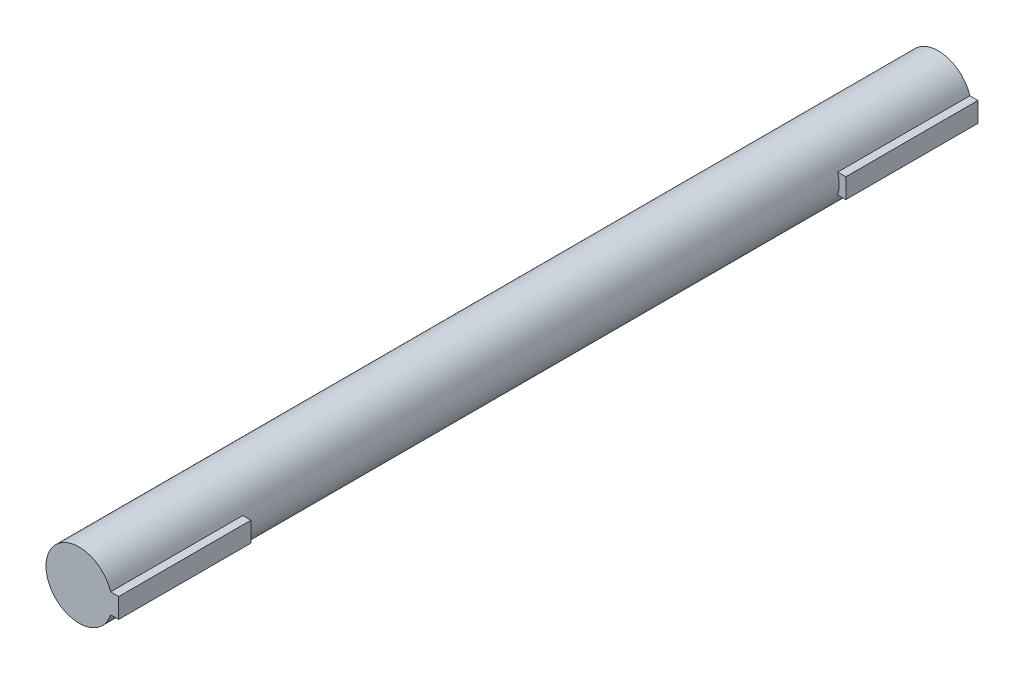
ISO-10303-21;
HEADER;
FILE_DESCRIPTION(('STEP AP214'),'2;1');
FILE_NAME('part.step','',(''),(''),'','','');
FILE_SCHEMA(('AUTOMOTIVE_DESIGN { 1 0 10303 214 1 1 1 1 }'));
ENDSEC;
DATA;
#1=APPLICATION_CONTEXT('core data for automotive mechanical design processes');
#2=APPLICATION_PROTOCOL_DEFINITION('international standard','automotive_design',2000,#1);
#3=PRODUCT_CONTEXT('',#1,'mechanical');
#4=PRODUCT('Part','Part','',(#3));
#5=PRODUCT_RELATED_PRODUCT_CATEGORY('part','',(#4));
#6=PRODUCT_DEFINITION_FORMATION('','',#4);
#7=PRODUCT_DEFINITION_CONTEXT('part definition',#1,'design');
#8=PRODUCT_DEFINITION('design','',#6,#7);
#9=PRODUCT_DEFINITION_SHAPE('','',#8);
#10=(LENGTH_UNIT() NAMED_UNIT(*) SI_UNIT(.MILLI.,.METRE.));
#11=(NAMED_UNIT(*) PLANE_ANGLE_UNIT() SI_UNIT($,.RADIAN.));
#12=(NAMED_UNIT(*) SI_UNIT($,.STERADIAN.) SOLID_ANGLE_UNIT());
#13=UNCERTAINTY_MEASURE_WITH_UNIT(LENGTH_MEASURE(1.E-05),#10,'distance_accuracy_value','');
#14=(GEOMETRIC_REPRESENTATION_CONTEXT(3) GLOBAL_UNCERTAINTY_ASSIGNED_CONTEXT((#13)) GLOBAL_UNIT_ASSIGNED_CONTEXT((#10,
#11,#12)) REPRESENTATION_CONTEXT('',''));
#15=CARTESIAN_POINT('',(0.,0.,0.));
#16=DIRECTION('',(0.,0.,1.));
#17=DIRECTION('',(1.,0.,0.));
#18=AXIS2_PLACEMENT_3D('',#15,#16,#17);
#19=CARTESIAN_POINT('',(0.,0.,260.));
#20=DIRECTION('',(0.,0.,-1.));
#21=DIRECTION('',(-1.,0.,0.));
#22=AXIS2_PLACEMENT_3D('',#19,#20,#21);
#23=CYLINDRICAL_SURFACE('',#22,10.);
#24=CARTESIAN_POINT('',(0.,0.,260.));
#25=DIRECTION('',(0.,0.,1.));
#26=DIRECTION('',(1.,0.,0.));
#27=AXIS2_PLACEMENT_3D('',#24,#25,#26);
#28=CIRCLE('',#27,10.);
#29=CARTESIAN_POINT('',(9.53939201416946,3.,260.));
#30=VERTEX_POINT('',#29);
#31=CARTESIAN_POINT('',(9.53939201416946,-3.,260.));
#32=VERTEX_POINT('',#31);
#33=EDGE_CURVE('E186',#30,#32,#28,.T.);
#34=ORIENTED_EDGE('',*,*,#33,.F.);
#35=DIRECTION('',(0.,0.,-1.));
#36=VECTOR('',#35,1.);
#37=CARTESIAN_POINT('',(9.53939201416946,3.,260.));
#38=LINE('',#37,#36);
#39=CARTESIAN_POINT('',(9.53939201416945,3.,220.));
#40=VERTEX_POINT('',#39);
#41=EDGE_CURVE('E181',#30,#40,#38,.T.);
#42=ORIENTED_EDGE('',*,*,#41,.T.);
#43=CARTESIAN_POINT('',(0.,0.,220.));
#44=DIRECTION('',(0.,0.,-1.));
#45=DIRECTION('',(-1.,0.,0.));
#46=AXIS2_PLACEMENT_3D('',#43,#44,#45);
#47=CIRCLE('',#46,10.);
#48=CARTESIAN_POINT('',(9.53939201416946,-3.,220.));
#49=VERTEX_POINT('',#48);
#50=EDGE_CURVE('E51',#40,#49,#47,.T.);
#51=ORIENTED_EDGE('',*,*,#50,.T.);
#52=DIRECTION('',(0.,0.,-1.));
#53=VECTOR('',#52,1.);
#54=CARTESIAN_POINT('',(9.53939201416946,-3.,260.));
#55=LINE('',#54,#53);
#56=EDGE_CURVE('E174',#49,#32,#55,.F.);
#57=ORIENTED_EDGE('',*,*,#56,.T.);
#58=EDGE_LOOP('',(#34,#42,#51,#57));
#59=FACE_BOUND('',#58,.T.);
#60=CARTESIAN_POINT('',(0.,0.,40.));
#61=DIRECTION('',(0.,0.,-1.));
#62=DIRECTION('',(-1.,0.,0.));
#63=AXIS2_PLACEMENT_3D('',#60,#61,#62);
#64=CIRCLE('',#63,10.);
#65=CARTESIAN_POINT('',(9.53939201416946,3.,40.));
#66=VERTEX_POINT('',#65);
#67=CARTESIAN_POINT('',(9.53939201416946,-3.,40.));
#68=VERTEX_POINT('',#67);
#69=EDGE_CURVE('E11',#66,#68,#64,.T.);
#70=ORIENTED_EDGE('',*,*,#69,.F.);
#71=DIRECTION('',(0.,0.,-1.));
#72=VECTOR('',#71,1.);
#73=CARTESIAN_POINT('',(9.53939201416946,3.,260.));
#74=LINE('',#73,#72);
#75=CARTESIAN_POINT('',(9.53939201416946,3.,0.));
#76=VERTEX_POINT('',#75);
#77=EDGE_CURVE('E111',#66,#76,#74,.T.);
#78=ORIENTED_EDGE('',*,*,#77,.T.);
#79=CARTESIAN_POINT('',(0.,0.,0.));
#80=DIRECTION('',(0.,0.,1.));
#81=DIRECTION('',(1.,0.,0.));
#82=AXIS2_PLACEMENT_3D('',#79,#80,#81);
#83=CIRCLE('',#82,10.);
#84=CARTESIAN_POINT('',(9.53939201416946,-3.,0.));
#85=VERTEX_POINT('',#84);
#86=EDGE_CURVE('E185',#76,#85,#83,.T.);
#87=ORIENTED_EDGE('',*,*,#86,.T.);
#88=DIRECTION('',(0.,0.,-1.));
#89=VECTOR('',#88,1.);
#90=CARTESIAN_POINT('',(9.53939201416946,-3.,260.));
#91=LINE('',#90,#89);
#92=EDGE_CURVE('E58',#85,#68,#91,.F.);
#93=ORIENTED_EDGE('',*,*,#92,.T.);
#94=EDGE_LOOP('',(#70,#78,#87,#93));
#95=FACE_BOUND('',#94,.T.);
#96=ADVANCED_FACE('F43',(#59,#95),#23,.T.);
#97=CARTESIAN_POINT('',(0.,0.,260.));
#98=DIRECTION('',(0.,0.,1.));
#99=DIRECTION('',(1.,0.,0.));
#100=AXIS2_PLACEMENT_3D('',#97,#98,#99);
#101=PLANE('',#100);
#102=ORIENTED_EDGE('',*,*,#33,.T.);
#103=DIRECTION('',(1.,0.,0.));
#104=VECTOR('',#103,1.);
#105=CARTESIAN_POINT('',(12.,-3.,260.));
#106=LINE('',#105,#104);
#107=CARTESIAN_POINT('',(12.,-3.,260.));
#108=VERTEX_POINT('',#107);
#109=EDGE_CURVE('E165',#32,#108,#106,.T.);
#110=ORIENTED_EDGE('',*,*,#109,.T.);
#111=DIRECTION('',(0.,1.,0.));
#112=VECTOR('',#111,1.);
#113=CARTESIAN_POINT('',(12.,3.,260.));
#114=LINE('',#113,#112);
#115=CARTESIAN_POINT('',(12.,3.,260.));
#116=VERTEX_POINT('',#115);
#117=EDGE_CURVE('E155',#108,#116,#114,.T.);
#118=ORIENTED_EDGE('',*,*,#117,.T.);
#119=DIRECTION('',(-1.,0.,0.));
#120=VECTOR('',#119,1.);
#121=CARTESIAN_POINT('',(0.,3.,260.));
#122=LINE('',#121,#120);
#123=EDGE_CURVE('E149',#116,#30,#122,.T.);
#124=ORIENTED_EDGE('',*,*,#123,.T.);
#125=EDGE_LOOP('',(#102,#110,#118,#124));
#126=FACE_BOUND('',#125,.T.);
#127=ADVANCED_FACE('F211',(#126),#101,.T.);
#128=CARTESIAN_POINT('',(0.,0.,0.));
#129=DIRECTION('',(0.,0.,1.));
#130=DIRECTION('',(1.,0.,0.));
#131=AXIS2_PLACEMENT_3D('',#128,#129,#130);
#132=PLANE('',#131);
#133=ORIENTED_EDGE('',*,*,#86,.F.);
#134=DIRECTION('',(1.,0.,0.));
#135=VECTOR('',#134,1.);
#136=CARTESIAN_POINT('',(0.,3.,0.));
#137=LINE('',#136,#135);
#138=CARTESIAN_POINT('',(12.,3.,0.));
#139=VERTEX_POINT('',#138);
#140=EDGE_CURVE('E135',#76,#139,#137,.T.);
#141=ORIENTED_EDGE('',*,*,#140,.T.);
#142=DIRECTION('',(0.,-1.,0.));
#143=VECTOR('',#142,1.);
#144=CARTESIAN_POINT('',(12.,3.,0.));
#145=LINE('',#144,#143);
#146=CARTESIAN_POINT('',(12.,-3.,0.));
#147=VERTEX_POINT('',#146);
#148=EDGE_CURVE('E122',#139,#147,#145,.T.);
#149=ORIENTED_EDGE('',*,*,#148,.T.);
#150=DIRECTION('',(-1.,0.,0.));
#151=VECTOR('',#150,1.);
#152=CARTESIAN_POINT('',(12.,-3.,0.));
#153=LINE('',#152,#151);
#154=EDGE_CURVE('E116',#147,#85,#153,.T.);
#155=ORIENTED_EDGE('',*,*,#154,.T.);
#156=EDGE_LOOP('',(#133,#141,#149,#155));
#157=FACE_BOUND('',#156,.T.);
#158=ADVANCED_FACE('F213',(#157),#132,.F.);
#159=CARTESIAN_POINT('',(0.,3.,220.));
#160=DIRECTION('',(0.,1.,0.));
#161=DIRECTION('',(0.,0.,1.));
#162=AXIS2_PLACEMENT_3D('',#159,#160,#161);
#163=PLANE('',#162);
#164=ORIENTED_EDGE('',*,*,#41,.F.);
#165=ORIENTED_EDGE('',*,*,#123,.F.);
#166=DIRECTION('',(0.,0.,1.));
#167=VECTOR('',#166,1.);
#168=CARTESIAN_POINT('',(12.,3.,220.));
#169=LINE('',#168,#167);
#170=CARTESIAN_POINT('',(12.,3.,220.));
#171=VERTEX_POINT('',#170);
#172=EDGE_CURVE('E171',#171,#116,#169,.T.);
#173=ORIENTED_EDGE('',*,*,#172,.F.);
#174=DIRECTION('',(-1.,0.,0.));
#175=VECTOR('',#174,1.);
#176=CARTESIAN_POINT('',(0.,3.,220.));
#177=LINE('',#176,#175);
#178=EDGE_CURVE('E150',#171,#40,#177,.T.);
#179=ORIENTED_EDGE('',*,*,#178,.T.);
#180=EDGE_LOOP('',(#164,#165,#173,#179));
#181=FACE_BOUND('',#180,.T.);
#182=ADVANCED_FACE('F202',(#181),#163,.T.);
#183=CARTESIAN_POINT('',(12.,-3.,220.));
#184=DIRECTION('',(0.,-1.,0.));
#185=DIRECTION('',(0.,0.,-1.));
#186=AXIS2_PLACEMENT_3D('',#183,#184,#185);
#187=PLANE('',#186);
#188=ORIENTED_EDGE('',*,*,#56,.F.);
#189=DIRECTION('',(1.,0.,0.));
#190=VECTOR('',#189,1.);
#191=CARTESIAN_POINT('',(12.,-3.,220.));
#192=LINE('',#191,#190);
#193=CARTESIAN_POINT('',(12.,-3.,220.));
#194=VERTEX_POINT('',#193);
#195=EDGE_CURVE('E154',#49,#194,#192,.T.);
#196=ORIENTED_EDGE('',*,*,#195,.T.);
#197=DIRECTION('',(0.,0.,1.));
#198=VECTOR('',#197,1.);
#199=CARTESIAN_POINT('',(12.,-3.,220.));
#200=LINE('',#199,#198);
#201=EDGE_CURVE('E162',#194,#108,#200,.T.);
#202=ORIENTED_EDGE('',*,*,#201,.T.);
#203=ORIENTED_EDGE('',*,*,#109,.F.);
#204=EDGE_LOOP('',(#188,#196,#202,#203));
#205=FACE_BOUND('',#204,.T.);
#206=ADVANCED_FACE('F209',(#205),#187,.T.);
#207=CARTESIAN_POINT('',(12.,3.,220.));
#208=DIRECTION('',(1.,0.,0.));
#209=DIRECTION('',(0.,0.,-1.));
#210=AXIS2_PLACEMENT_3D('',#207,#208,#209);
#211=PLANE('',#210);
#212=ORIENTED_EDGE('',*,*,#117,.F.);
#213=ORIENTED_EDGE('',*,*,#201,.F.);
#214=DIRECTION('',(0.,1.,0.));
#215=VECTOR('',#214,1.);
#216=CARTESIAN_POINT('',(12.,3.,220.));
#217=LINE('',#216,#215);
#218=EDGE_CURVE('E158',#194,#171,#217,.T.);
#219=ORIENTED_EDGE('',*,*,#218,.T.);
#220=ORIENTED_EDGE('',*,*,#172,.T.);
#221=EDGE_LOOP('',(#212,#213,#219,#220));
#222=FACE_BOUND('',#221,.T.);
#223=ADVANCED_FACE('F206',(#222),#211,.T.);
#224=CARTESIAN_POINT('',(0.,0.,220.));
#225=DIRECTION('',(0.,0.,-1.));
#226=DIRECTION('',(-1.,0.,0.));
#227=AXIS2_PLACEMENT_3D('',#224,#225,#226);
#228=PLANE('',#227);
#229=ORIENTED_EDGE('',*,*,#50,.F.);
#230=ORIENTED_EDGE('',*,*,#178,.F.);
#231=ORIENTED_EDGE('',*,*,#218,.F.);
#232=ORIENTED_EDGE('',*,*,#195,.F.);
#233=EDGE_LOOP('',(#229,#230,#231,#232));
#234=FACE_BOUND('',#233,.T.);
#235=ADVANCED_FACE('F199',(#234),#228,.T.);
#236=CARTESIAN_POINT('',(0.,3.,40.));
#237=DIRECTION('',(0.,1.,0.));
#238=DIRECTION('',(0.,0.,1.));
#239=AXIS2_PLACEMENT_3D('',#236,#237,#238);
#240=PLANE('',#239);
#241=ORIENTED_EDGE('',*,*,#77,.F.);
#242=DIRECTION('',(1.,0.,0.));
#243=VECTOR('',#242,1.);
#244=CARTESIAN_POINT('',(0.,3.,40.));
#245=LINE('',#244,#243);
#246=CARTESIAN_POINT('',(12.,3.,40.));
#247=VERTEX_POINT('',#246);
#248=EDGE_CURVE('E105',#66,#247,#245,.T.);
#249=ORIENTED_EDGE('',*,*,#248,.T.);
#250=DIRECTION('',(0.,0.,-1.));
#251=VECTOR('',#250,1.);
#252=CARTESIAN_POINT('',(12.,3.,40.));
#253=LINE('',#252,#251);
#254=EDGE_CURVE('E109',#247,#139,#253,.T.);
#255=ORIENTED_EDGE('',*,*,#254,.T.);
#256=ORIENTED_EDGE('',*,*,#140,.F.);
#257=EDGE_LOOP('',(#241,#249,#255,#256));
#258=FACE_BOUND('',#257,.T.);
#259=ADVANCED_FACE('F107',(#258),#240,.T.);
#260=CARTESIAN_POINT('',(12.,-3.,40.));
#261=DIRECTION('',(0.,-1.,0.));
#262=DIRECTION('',(0.,0.,-1.));
#263=AXIS2_PLACEMENT_3D('',#260,#261,#262);
#264=PLANE('',#263);
#265=ORIENTED_EDGE('',*,*,#92,.F.);
#266=ORIENTED_EDGE('',*,*,#154,.F.);
#267=DIRECTION('',(0.,0.,-1.));
#268=VECTOR('',#267,1.);
#269=CARTESIAN_POINT('',(12.,-3.,40.));
#270=LINE('',#269,#268);
#271=CARTESIAN_POINT('',(12.,-3.,40.));
#272=VERTEX_POINT('',#271);
#273=EDGE_CURVE('E124',#272,#147,#270,.T.);
#274=ORIENTED_EDGE('',*,*,#273,.F.);
#275=DIRECTION('',(-1.,0.,0.));
#276=VECTOR('',#275,1.);
#277=CARTESIAN_POINT('',(12.,-3.,40.));
#278=LINE('',#277,#276);
#279=EDGE_CURVE('E125',#272,#68,#278,.T.);
#280=ORIENTED_EDGE('',*,*,#279,.T.);
#281=EDGE_LOOP('',(#265,#266,#274,#280));
#282=FACE_BOUND('',#281,.T.);
#283=ADVANCED_FACE('F231',(#282),#264,.T.);
#284=CARTESIAN_POINT('',(12.,3.,40.));
#285=DIRECTION('',(1.,0.,0.));
#286=DIRECTION('',(0.,0.,-1.));
#287=AXIS2_PLACEMENT_3D('',#284,#285,#286);
#288=PLANE('',#287);
#289=ORIENTED_EDGE('',*,*,#148,.F.);
#290=ORIENTED_EDGE('',*,*,#254,.F.);
#291=DIRECTION('',(0.,-1.,0.));
#292=VECTOR('',#291,1.);
#293=CARTESIAN_POINT('',(12.,3.,40.));
#294=LINE('',#293,#292);
#295=EDGE_CURVE('E115',#247,#272,#294,.T.);
#296=ORIENTED_EDGE('',*,*,#295,.T.);
#297=ORIENTED_EDGE('',*,*,#273,.T.);
#298=EDGE_LOOP('',(#289,#290,#296,#297));
#299=FACE_BOUND('',#298,.T.);
#300=ADVANCED_FACE('F120',(#299),#288,.T.);
#301=CARTESIAN_POINT('',(0.,0.,40.));
#302=DIRECTION('',(0.,0.,-1.));
#303=DIRECTION('',(-1.,0.,0.));
#304=AXIS2_PLACEMENT_3D('',#301,#302,#303);
#305=PLANE('',#304);
#306=ORIENTED_EDGE('',*,*,#248,.F.);
#307=ORIENTED_EDGE('',*,*,#69,.T.);
#308=ORIENTED_EDGE('',*,*,#279,.F.);
#309=ORIENTED_EDGE('',*,*,#295,.F.);
#310=EDGE_LOOP('',(#306,#307,#308,#309));
#311=FACE_BOUND('',#310,.T.);
#312=ADVANCED_FACE('F128',(#311),#305,.F.);
#313=CLOSED_SHELL('',(#96,#127,#158,#182,#206,#223,#235,#259,#283,#300,#312));
#314=MANIFOLD_SOLID_BREP('B2',#313);
#315=ADVANCED_BREP_SHAPE_REPRESENTATION('',(#18,#314),#14);
#316=SHAPE_DEFINITION_REPRESENTATION(#9,#315);
ENDSEC;
END-ISO-10303-21;
